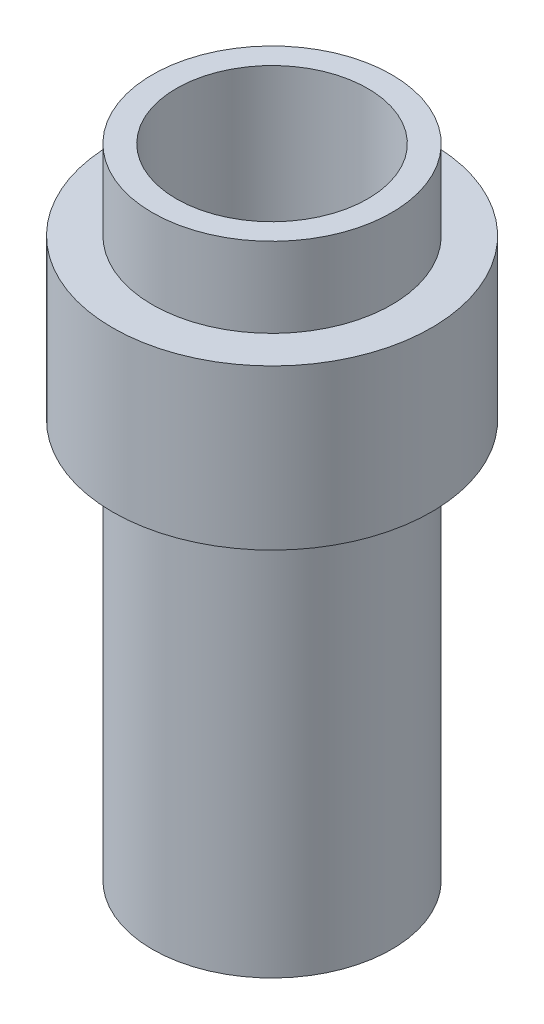
ISO-10303-21;
HEADER;
FILE_DESCRIPTION(('STEP AP214'),'2;1');
FILE_NAME('part.step','',(''),(''),'','','');
FILE_SCHEMA(('AUTOMOTIVE_DESIGN { 1 0 10303 214 1 1 1 1 }'));
ENDSEC;
DATA;
#1=APPLICATION_CONTEXT('core data for automotive mechanical design processes');
#2=APPLICATION_PROTOCOL_DEFINITION('international standard','automotive_design',2000,#1);
#3=PRODUCT_CONTEXT('',#1,'mechanical');
#4=PRODUCT('Part','Part','',(#3));
#5=PRODUCT_RELATED_PRODUCT_CATEGORY('part','',(#4));
#6=PRODUCT_DEFINITION_FORMATION('','',#4);
#7=PRODUCT_DEFINITION_CONTEXT('part definition',#1,'design');
#8=PRODUCT_DEFINITION('design','',#6,#7);
#9=PRODUCT_DEFINITION_SHAPE('','',#8);
#10=(LENGTH_UNIT() NAMED_UNIT(*) SI_UNIT(.MILLI.,.METRE.));
#11=(NAMED_UNIT(*) PLANE_ANGLE_UNIT() SI_UNIT($,.RADIAN.));
#12=(NAMED_UNIT(*) SI_UNIT($,.STERADIAN.) SOLID_ANGLE_UNIT());
#13=UNCERTAINTY_MEASURE_WITH_UNIT(LENGTH_MEASURE(1.E-05),#10,'distance_accuracy_value','');
#14=(GEOMETRIC_REPRESENTATION_CONTEXT(3) GLOBAL_UNCERTAINTY_ASSIGNED_CONTEXT((#13)) GLOBAL_UNIT_ASSIGNED_CONTEXT((#10,
#11,#12)) REPRESENTATION_CONTEXT('',''));
#15=CARTESIAN_POINT('',(0.,0.,0.));
#16=DIRECTION('',(0.,0.,1.));
#17=DIRECTION('',(1.,0.,0.));
#18=AXIS2_PLACEMENT_3D('',#15,#16,#17);
#19=CARTESIAN_POINT('',(0.,40.,0.));
#20=DIRECTION('',(0.,-1.,0.));
#21=DIRECTION('',(0.,0.,-1.));
#22=AXIS2_PLACEMENT_3D('',#19,#20,#21);
#23=CYLINDRICAL_SURFACE('',#22,7.5);
#24=CARTESIAN_POINT('',(0.,0.,0.));
#25=DIRECTION('',(0.,1.,0.));
#26=DIRECTION('',(0.,0.,1.));
#27=AXIS2_PLACEMENT_3D('',#24,#25,#26);
#28=CIRCLE('',#27,7.5);
#29=CARTESIAN_POINT('',(0.,0.,7.5));
#30=VERTEX_POINT('',#29);
#31=EDGE_CURVE('E42',#30,#30,#28,.T.);
#32=ORIENTED_EDGE('',*,*,#31,.T.);
#33=EDGE_LOOP('',(#32));
#34=FACE_BOUND('',#33,.T.);
#35=CARTESIAN_POINT('',(0.,25.,0.));
#36=DIRECTION('',(0.,1.,0.));
#37=DIRECTION('',(0.,0.,1.));
#38=AXIS2_PLACEMENT_3D('',#35,#36,#37);
#39=CIRCLE('',#38,7.5);
#40=CARTESIAN_POINT('',(0.,25.,7.5));
#41=VERTEX_POINT('',#40);
#42=EDGE_CURVE('E10',#41,#41,#39,.T.);
#43=ORIENTED_EDGE('',*,*,#42,.F.);
#44=EDGE_LOOP('',(#43));
#45=FACE_BOUND('',#44,.T.);
#46=ADVANCED_FACE('F31',(#34,#45),#23,.T.);
#47=CARTESIAN_POINT('',(0.,40.,0.));
#48=DIRECTION('',(0.,1.,0.));
#49=DIRECTION('',(0.,0.,1.));
#50=AXIS2_PLACEMENT_3D('',#47,#48,#49);
#51=PLANE('',#50);
#52=CARTESIAN_POINT('',(0.,40.,0.));
#53=DIRECTION('',(0.,1.,0.));
#54=DIRECTION('',(0.,0.,1.));
#55=AXIS2_PLACEMENT_3D('',#52,#53,#54);
#56=CIRCLE('',#55,7.5);
#57=CARTESIAN_POINT('',(0.,40.,7.5));
#58=VERTEX_POINT('',#57);
#59=EDGE_CURVE('E38',#58,#58,#56,.T.);
#60=ORIENTED_EDGE('',*,*,#59,.T.);
#61=EDGE_LOOP('',(#60));
#62=FACE_BOUND('',#61,.T.);
#63=CARTESIAN_POINT('',(0.,40.,0.));
#64=DIRECTION('',(0.,1.,0.));
#65=DIRECTION('',(0.,0.,1.));
#66=AXIS2_PLACEMENT_3D('',#63,#64,#65);
#67=CIRCLE('',#66,6.);
#68=CARTESIAN_POINT('',(0.,40.,6.));
#69=VERTEX_POINT('',#68);
#70=EDGE_CURVE('E47',#69,#69,#67,.T.);
#71=ORIENTED_EDGE('',*,*,#70,.F.);
#72=EDGE_LOOP('',(#71));
#73=FACE_BOUND('',#72,.T.);
#74=ADVANCED_FACE('F86',(#62,#73),#51,.T.);
#75=CARTESIAN_POINT('',(0.,0.,0.));
#76=DIRECTION('',(0.,1.,0.));
#77=DIRECTION('',(0.,0.,1.));
#78=AXIS2_PLACEMENT_3D('',#75,#76,#77);
#79=PLANE('',#78);
#80=ORIENTED_EDGE('',*,*,#31,.F.);
#81=EDGE_LOOP('',(#80));
#82=FACE_BOUND('',#81,.T.);
#83=CARTESIAN_POINT('',(0.,0.,0.));
#84=DIRECTION('',(0.,1.,0.));
#85=DIRECTION('',(0.,0.,1.));
#86=AXIS2_PLACEMENT_3D('',#83,#84,#85);
#87=CIRCLE('',#86,6.);
#88=CARTESIAN_POINT('',(0.,0.,6.));
#89=VERTEX_POINT('',#88);
#90=EDGE_CURVE('E49',#89,#89,#87,.T.);
#91=ORIENTED_EDGE('',*,*,#90,.T.);
#92=EDGE_LOOP('',(#91));
#93=FACE_BOUND('',#92,.T.);
#94=ADVANCED_FACE('F91',(#82,#93),#79,.F.);
#95=CARTESIAN_POINT('',(0.,35.,0.));
#96=DIRECTION('',(0.,1.,0.));
#97=DIRECTION('',(0.,0.,1.));
#98=AXIS2_PLACEMENT_3D('',#95,#96,#97);
#99=CIRCLE('',#98,7.5);
#100=CARTESIAN_POINT('',(0.,35.,7.5));
#101=VERTEX_POINT('',#100);
#102=EDGE_CURVE('E58',#101,#101,#99,.T.);
#103=ORIENTED_EDGE('',*,*,#102,.T.);
#104=EDGE_LOOP('',(#103));
#105=FACE_BOUND('',#104,.T.);
#106=ORIENTED_EDGE('',*,*,#59,.F.);
#107=EDGE_LOOP('',(#106));
#108=FACE_BOUND('',#107,.T.);
#109=ADVANCED_FACE('F33',(#105,#108),#23,.T.);
#110=CARTESIAN_POINT('',(0.,40.,0.));
#111=DIRECTION('',(0.,-1.,0.));
#112=DIRECTION('',(0.,0.,-1.));
#113=AXIS2_PLACEMENT_3D('',#110,#111,#112);
#114=CYLINDRICAL_SURFACE('',#113,6.);
#115=ORIENTED_EDGE('',*,*,#70,.T.);
#116=EDGE_LOOP('',(#115));
#117=FACE_BOUND('',#116,.T.);
#118=ORIENTED_EDGE('',*,*,#90,.F.);
#119=EDGE_LOOP('',(#118));
#120=FACE_BOUND('',#119,.T.);
#121=ADVANCED_FACE('F75',(#117,#120),#114,.F.);
#122=CARTESIAN_POINT('',(0.,25.,0.));
#123=DIRECTION('',(0.,1.,0.));
#124=DIRECTION('',(0.,0.,1.));
#125=AXIS2_PLACEMENT_3D('',#122,#123,#124);
#126=CYLINDRICAL_SURFACE('',#125,10.);
#127=CARTESIAN_POINT('',(0.,25.,0.));
#128=DIRECTION('',(0.,1.,0.));
#129=DIRECTION('',(0.,0.,1.));
#130=AXIS2_PLACEMENT_3D('',#127,#128,#129);
#131=CIRCLE('',#130,10.);
#132=CARTESIAN_POINT('',(0.,25.,10.));
#133=VERTEX_POINT('',#132);
#134=EDGE_CURVE('E52',#133,#133,#131,.T.);
#135=ORIENTED_EDGE('',*,*,#134,.T.);
#136=EDGE_LOOP('',(#135));
#137=FACE_BOUND('',#136,.T.);
#138=CARTESIAN_POINT('',(0.,35.,0.));
#139=DIRECTION('',(0.,1.,0.));
#140=DIRECTION('',(0.,0.,1.));
#141=AXIS2_PLACEMENT_3D('',#138,#139,#140);
#142=CIRCLE('',#141,10.);
#143=CARTESIAN_POINT('',(0.,35.,10.));
#144=VERTEX_POINT('',#143);
#145=EDGE_CURVE('E55',#144,#144,#142,.T.);
#146=ORIENTED_EDGE('',*,*,#145,.F.);
#147=EDGE_LOOP('',(#146));
#148=FACE_BOUND('',#147,.T.);
#149=ADVANCED_FACE('F73',(#137,#148),#126,.T.);
#150=CARTESIAN_POINT('',(0.,25.,0.));
#151=DIRECTION('',(0.,1.,0.));
#152=DIRECTION('',(0.,0.,1.));
#153=AXIS2_PLACEMENT_3D('',#150,#151,#152);
#154=PLANE('',#153);
#155=ORIENTED_EDGE('',*,*,#42,.T.);
#156=EDGE_LOOP('',(#155));
#157=FACE_BOUND('',#156,.T.);
#158=ORIENTED_EDGE('',*,*,#134,.F.);
#159=EDGE_LOOP('',(#158));
#160=FACE_BOUND('',#159,.T.);
#161=ADVANCED_FACE('F69',(#157,#160),#154,.F.);
#162=CARTESIAN_POINT('',(0.,35.,0.));
#163=DIRECTION('',(0.,1.,0.));
#164=DIRECTION('',(0.,0.,1.));
#165=AXIS2_PLACEMENT_3D('',#162,#163,#164);
#166=PLANE('',#165);
#167=ORIENTED_EDGE('',*,*,#102,.F.);
#168=EDGE_LOOP('',(#167));
#169=FACE_BOUND('',#168,.T.);
#170=ORIENTED_EDGE('',*,*,#145,.T.);
#171=EDGE_LOOP('',(#170));
#172=FACE_BOUND('',#171,.T.);
#173=ADVANCED_FACE('F66',(#169,#172),#166,.T.);
#174=CLOSED_SHELL('',(#46,#74,#94,#109,#121,#149,#161,#173));
#175=MANIFOLD_SOLID_BREP('B2',#174);
#176=ADVANCED_BREP_SHAPE_REPRESENTATION('',(#18,#175),#14);
#177=SHAPE_DEFINITION_REPRESENTATION(#9,#176);
ENDSEC;
END-ISO-10303-21;
